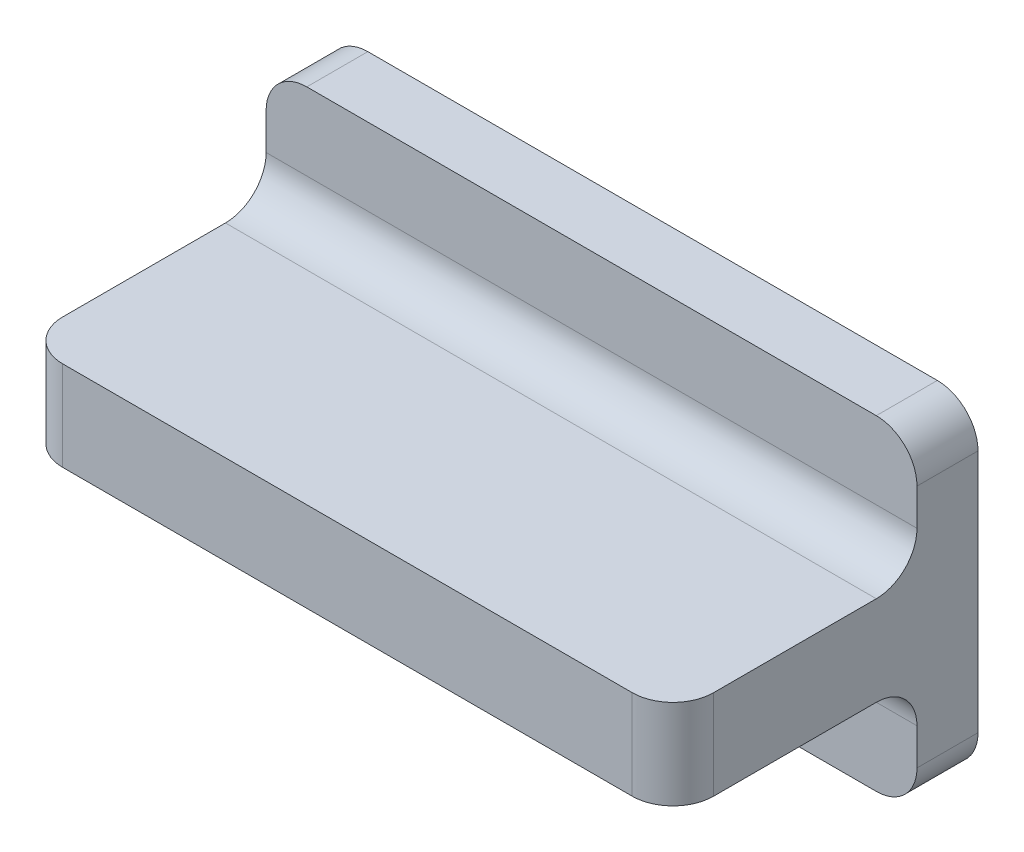
ISO-10303-21;
HEADER;
FILE_DESCRIPTION(('STEP AP214'),'2;1');
FILE_NAME('part.step','',(''),(''),'','','');
FILE_SCHEMA(('AUTOMOTIVE_DESIGN { 1 0 10303 214 1 1 1 1 }'));
ENDSEC;
DATA;
#1=APPLICATION_CONTEXT('core data for automotive mechanical design processes');
#2=APPLICATION_PROTOCOL_DEFINITION('international standard','automotive_design',2000,#1);
#3=PRODUCT_CONTEXT('',#1,'mechanical');
#4=PRODUCT('Part','Part','',(#3));
#5=PRODUCT_RELATED_PRODUCT_CATEGORY('part','',(#4));
#6=PRODUCT_DEFINITION_FORMATION('','',#4);
#7=PRODUCT_DEFINITION_CONTEXT('part definition',#1,'design');
#8=PRODUCT_DEFINITION('design','',#6,#7);
#9=PRODUCT_DEFINITION_SHAPE('','',#8);
#10=(LENGTH_UNIT() NAMED_UNIT(*) SI_UNIT(.MILLI.,.METRE.));
#11=(NAMED_UNIT(*) PLANE_ANGLE_UNIT() SI_UNIT($,.RADIAN.));
#12=(NAMED_UNIT(*) SI_UNIT($,.STERADIAN.) SOLID_ANGLE_UNIT());
#13=UNCERTAINTY_MEASURE_WITH_UNIT(LENGTH_MEASURE(1.E-05),#10,'distance_accuracy_value','');
#14=(GEOMETRIC_REPRESENTATION_CONTEXT(3) GLOBAL_UNCERTAINTY_ASSIGNED_CONTEXT((#13)) GLOBAL_UNIT_ASSIGNED_CONTEXT((#10,
#11,#12)) REPRESENTATION_CONTEXT('',''));
#15=CARTESIAN_POINT('',(0.,0.,0.));
#16=DIRECTION('',(0.,0.,1.));
#17=DIRECTION('',(1.,0.,0.));
#18=AXIS2_PLACEMENT_3D('',#15,#16,#17);
#19=CARTESIAN_POINT('',(0.,0.,4.7625));
#20=DIRECTION('',(0.,0.,1.));
#21=DIRECTION('',(1.,0.,0.));
#22=AXIS2_PLACEMENT_3D('',#19,#20,#21);
#23=PLANE('',#22);
#24=DIRECTION('',(0.,1.,0.));
#25=VECTOR('',#24,1.);
#26=CARTESIAN_POINT('',(25.4,12.7,4.7625));
#27=LINE('',#26,#25);
#28=CARTESIAN_POINT('',(25.4,-9.525,4.7625));
#29=VERTEX_POINT('',#28);
#30=CARTESIAN_POINT('',(25.4,-6.675,4.7625));
#31=VERTEX_POINT('',#30);
#32=EDGE_CURVE('E238',#29,#31,#27,.T.);
#33=ORIENTED_EDGE('',*,*,#32,.T.);
#34=DIRECTION('',(1.,0.,0.));
#35=VECTOR('',#34,1.);
#36=CARTESIAN_POINT('',(0.,-6.675,4.7625));
#37=LINE('',#36,#35);
#38=CARTESIAN_POINT('',(-25.4,-6.675,4.7625));
#39=VERTEX_POINT('',#38);
#40=EDGE_CURVE('E198',#31,#39,#37,.F.);
#41=ORIENTED_EDGE('',*,*,#40,.T.);
#42=DIRECTION('',(0.,-1.,0.));
#43=VECTOR('',#42,1.);
#44=CARTESIAN_POINT('',(-25.4,12.7,4.7625));
#45=LINE('',#44,#43);
#46=CARTESIAN_POINT('',(-25.4,-9.525,4.7625));
#47=VERTEX_POINT('',#46);
#48=EDGE_CURVE('E255',#39,#47,#45,.T.);
#49=ORIENTED_EDGE('',*,*,#48,.T.);
#50=CARTESIAN_POINT('',(-22.225,-9.525,4.7625));
#51=DIRECTION('',(0.,0.,1.));
#52=DIRECTION('',(1.,0.,0.));
#53=AXIS2_PLACEMENT_3D('',#50,#51,#52);
#54=CIRCLE('',#53,3.175);
#55=CARTESIAN_POINT('',(-22.225,-12.7,4.7625));
#56=VERTEX_POINT('',#55);
#57=EDGE_CURVE('E194',#47,#56,#54,.T.);
#58=ORIENTED_EDGE('',*,*,#57,.T.);
#59=DIRECTION('',(1.,0.,0.));
#60=VECTOR('',#59,1.);
#61=CARTESIAN_POINT('',(-25.4,-12.7,4.7625));
#62=LINE('',#61,#60);
#63=CARTESIAN_POINT('',(22.225,-12.7,4.7625));
#64=VERTEX_POINT('',#63);
#65=EDGE_CURVE('E178',#56,#64,#62,.T.);
#66=ORIENTED_EDGE('',*,*,#65,.T.);
#67=CARTESIAN_POINT('',(22.225,-9.525,4.7625));
#68=DIRECTION('',(0.,0.,1.));
#69=DIRECTION('',(1.,0.,0.));
#70=AXIS2_PLACEMENT_3D('',#67,#68,#69);
#71=CIRCLE('',#70,3.175);
#72=EDGE_CURVE('E196',#64,#29,#71,.T.);
#73=ORIENTED_EDGE('',*,*,#72,.T.);
#74=EDGE_LOOP('',(#33,#41,#49,#58,#66,#73));
#75=FACE_BOUND('',#74,.T.);
#76=ADVANCED_FACE('F33',(#75),#23,.T.);
#77=CARTESIAN_POINT('',(25.4,12.7,4.7625));
#78=DIRECTION('',(-1.,0.,0.));
#79=DIRECTION('',(0.,0.,1.));
#80=AXIS2_PLACEMENT_3D('',#77,#78,#79);
#81=PLANE('',#80);
#82=DIRECTION('',(0.,0.,-1.));
#83=VECTOR('',#82,1.);
#84=CARTESIAN_POINT('',(25.4,3.5,23.8125));
#85=LINE('',#84,#83);
#86=CARTESIAN_POINT('',(25.4,3.5,20.6375));
#87=VERTEX_POINT('',#86);
#88=CARTESIAN_POINT('',(25.4,3.5,7.93750000000001));
#89=VERTEX_POINT('',#88);
#90=EDGE_CURVE('E168',#87,#89,#85,.T.);
#91=ORIENTED_EDGE('',*,*,#90,.F.);
#92=DIRECTION('',(0.,1.,0.));
#93=VECTOR('',#92,1.);
#94=CARTESIAN_POINT('',(25.4,-3.5,20.6375));
#95=LINE('',#94,#93);
#96=CARTESIAN_POINT('',(25.4,-3.5,20.6375));
#97=VERTEX_POINT('',#96);
#98=EDGE_CURVE('E212',#87,#97,#95,.F.);
#99=ORIENTED_EDGE('',*,*,#98,.T.);
#100=DIRECTION('',(0.,0.,-1.));
#101=VECTOR('',#100,1.);
#102=CARTESIAN_POINT('',(25.4,-3.5,23.8125));
#103=LINE('',#102,#101);
#104=CARTESIAN_POINT('',(25.4,-3.5,7.93750000000001));
#105=VERTEX_POINT('',#104);
#106=EDGE_CURVE('E241',#97,#105,#103,.T.);
#107=ORIENTED_EDGE('',*,*,#106,.T.);
#108=CARTESIAN_POINT('',(25.4,-6.675,7.9375));
#109=DIRECTION('',(-1.,0.,0.));
#110=DIRECTION('',(0.,0.,1.));
#111=AXIS2_PLACEMENT_3D('',#108,#109,#110);
#112=CIRCLE('',#111,3.175);
#113=EDGE_CURVE('E41',#105,#31,#112,.T.);
#114=ORIENTED_EDGE('',*,*,#113,.T.);
#115=ORIENTED_EDGE('',*,*,#32,.F.);
#116=DIRECTION('',(0.,0.,-1.));
#117=VECTOR('',#116,1.);
#118=CARTESIAN_POINT('',(25.4,-9.525,4.7625));
#119=LINE('',#118,#117);
#120=CARTESIAN_POINT('',(25.4,-9.525,0.));
#121=VERTEX_POINT('',#120);
#122=EDGE_CURVE('E156',#29,#121,#119,.T.);
#123=ORIENTED_EDGE('',*,*,#122,.T.);
#124=DIRECTION('',(0.,1.,0.));
#125=VECTOR('',#124,1.);
#126=CARTESIAN_POINT('',(25.4,12.7,0.));
#127=LINE('',#126,#125);
#128=CARTESIAN_POINT('',(25.4,9.525,0.));
#129=VERTEX_POINT('',#128);
#130=EDGE_CURVE('E264',#121,#129,#127,.T.);
#131=ORIENTED_EDGE('',*,*,#130,.T.);
#132=DIRECTION('',(0.,0.,-1.));
#133=VECTOR('',#132,1.);
#134=CARTESIAN_POINT('',(25.4,9.525,4.7625));
#135=LINE('',#134,#133);
#136=CARTESIAN_POINT('',(25.4,9.525,4.7625));
#137=VERTEX_POINT('',#136);
#138=EDGE_CURVE('E210',#129,#137,#135,.F.);
#139=ORIENTED_EDGE('',*,*,#138,.T.);
#140=CARTESIAN_POINT('',(25.4,6.675,4.7625));
#141=VERTEX_POINT('',#140);
#142=EDGE_CURVE('E251',#141,#137,#27,.T.);
#143=ORIENTED_EDGE('',*,*,#142,.F.);
#144=CARTESIAN_POINT('',(25.4,6.675,7.9375));
#145=DIRECTION('',(-1.,0.,0.));
#146=DIRECTION('',(0.,0.,1.));
#147=AXIS2_PLACEMENT_3D('',#144,#145,#146);
#148=CIRCLE('',#147,3.175);
#149=EDGE_CURVE('E231',#141,#89,#148,.T.);
#150=ORIENTED_EDGE('',*,*,#149,.T.);
#151=EDGE_LOOP('',(#91,#99,#107,#114,#115,#123,#131,#139,#143,#150));
#152=FACE_BOUND('',#151,.T.);
#153=ADVANCED_FACE('F237',(#152),#81,.F.);
#154=CARTESIAN_POINT('',(-25.4,12.7,4.7625));
#155=DIRECTION('',(0.,-1.,0.));
#156=DIRECTION('',(0.,0.,-1.));
#157=AXIS2_PLACEMENT_3D('',#154,#155,#156);
#158=PLANE('',#157);
#159=DIRECTION('',(-1.,0.,0.));
#160=VECTOR('',#159,1.);
#161=CARTESIAN_POINT('',(-25.4,12.7,4.7625));
#162=LINE('',#161,#160);
#163=CARTESIAN_POINT('',(22.225,12.7,4.7625));
#164=VERTEX_POINT('',#163);
#165=CARTESIAN_POINT('',(-22.225,12.7,4.7625));
#166=VERTEX_POINT('',#165);
#167=EDGE_CURVE('E250',#164,#166,#162,.T.);
#168=ORIENTED_EDGE('',*,*,#167,.F.);
#169=DIRECTION('',(0.,0.,-1.));
#170=VECTOR('',#169,1.);
#171=CARTESIAN_POINT('',(22.225,12.7,4.7625));
#172=LINE('',#171,#170);
#173=CARTESIAN_POINT('',(22.225,12.7,0.));
#174=VERTEX_POINT('',#173);
#175=EDGE_CURVE('E216',#164,#174,#172,.T.);
#176=ORIENTED_EDGE('',*,*,#175,.T.);
#177=DIRECTION('',(-1.,0.,0.));
#178=VECTOR('',#177,1.);
#179=CARTESIAN_POINT('',(-25.4,12.7,0.));
#180=LINE('',#179,#178);
#181=CARTESIAN_POINT('',(-22.225,12.7,0.));
#182=VERTEX_POINT('',#181);
#183=EDGE_CURVE('E273',#174,#182,#180,.T.);
#184=ORIENTED_EDGE('',*,*,#183,.T.);
#185=DIRECTION('',(0.,0.,-1.));
#186=VECTOR('',#185,1.);
#187=CARTESIAN_POINT('',(-22.225,12.7,4.7625));
#188=LINE('',#187,#186);
#189=EDGE_CURVE('E214',#182,#166,#188,.F.);
#190=ORIENTED_EDGE('',*,*,#189,.T.);
#191=EDGE_LOOP('',(#168,#176,#184,#190));
#192=FACE_BOUND('',#191,.T.);
#193=ADVANCED_FACE('F296',(#192),#158,.F.);
#194=CARTESIAN_POINT('',(-25.4,12.7,4.7625));
#195=DIRECTION('',(1.,0.,0.));
#196=DIRECTION('',(0.,1.,0.));
#197=AXIS2_PLACEMENT_3D('',#194,#195,#196);
#198=PLANE('',#197);
#199=DIRECTION('',(0.,0.,-1.));
#200=VECTOR('',#199,1.);
#201=CARTESIAN_POINT('',(-25.4,-3.5,23.8125));
#202=LINE('',#201,#200);
#203=CARTESIAN_POINT('',(-25.4,-3.5,20.6375));
#204=VERTEX_POINT('',#203);
#205=CARTESIAN_POINT('',(-25.4,-3.5,7.93750000000001));
#206=VERTEX_POINT('',#205);
#207=EDGE_CURVE('E153',#204,#206,#202,.T.);
#208=ORIENTED_EDGE('',*,*,#207,.F.);
#209=DIRECTION('',(0.,-1.,0.));
#210=VECTOR('',#209,1.);
#211=CARTESIAN_POINT('',(-25.4,3.5,20.6375));
#212=LINE('',#211,#210);
#213=CARTESIAN_POINT('',(-25.4,3.5,20.6375));
#214=VERTEX_POINT('',#213);
#215=EDGE_CURVE('E148',#204,#214,#212,.F.);
#216=ORIENTED_EDGE('',*,*,#215,.T.);
#217=DIRECTION('',(0.,0.,-1.));
#218=VECTOR('',#217,1.);
#219=CARTESIAN_POINT('',(-25.4,3.5,23.8125));
#220=LINE('',#219,#218);
#221=CARTESIAN_POINT('',(-25.4,3.5,7.93750000000001));
#222=VERTEX_POINT('',#221);
#223=EDGE_CURVE('E151',#214,#222,#220,.T.);
#224=ORIENTED_EDGE('',*,*,#223,.T.);
#225=CARTESIAN_POINT('',(-25.4,6.675,7.9375));
#226=DIRECTION('',(1.,0.,0.));
#227=DIRECTION('',(0.,1.,0.));
#228=AXIS2_PLACEMENT_3D('',#225,#226,#227);
#229=CIRCLE('',#228,3.175);
#230=CARTESIAN_POINT('',(-25.4,6.675,4.7625));
#231=VERTEX_POINT('',#230);
#232=EDGE_CURVE('E229',#222,#231,#229,.T.);
#233=ORIENTED_EDGE('',*,*,#232,.T.);
#234=CARTESIAN_POINT('',(-25.4,9.525,4.7625));
#235=VERTEX_POINT('',#234);
#236=EDGE_CURVE('E269',#235,#231,#45,.T.);
#237=ORIENTED_EDGE('',*,*,#236,.F.);
#238=DIRECTION('',(0.,0.,-1.));
#239=VECTOR('',#238,1.);
#240=CARTESIAN_POINT('',(-25.4,9.525,4.7625));
#241=LINE('',#240,#239);
#242=CARTESIAN_POINT('',(-25.4,9.525,0.));
#243=VERTEX_POINT('',#242);
#244=EDGE_CURVE('E157',#235,#243,#241,.T.);
#245=ORIENTED_EDGE('',*,*,#244,.T.);
#246=DIRECTION('',(0.,-1.,0.));
#247=VECTOR('',#246,1.);
#248=CARTESIAN_POINT('',(-25.4,12.7,0.));
#249=LINE('',#248,#247);
#250=CARTESIAN_POINT('',(-25.4,-9.525,0.));
#251=VERTEX_POINT('',#250);
#252=EDGE_CURVE('E276',#243,#251,#249,.T.);
#253=ORIENTED_EDGE('',*,*,#252,.T.);
#254=DIRECTION('',(0.,0.,-1.));
#255=VECTOR('',#254,1.);
#256=CARTESIAN_POINT('',(-25.4,-9.525,4.7625));
#257=LINE('',#256,#255);
#258=EDGE_CURVE('E204',#251,#47,#257,.F.);
#259=ORIENTED_EDGE('',*,*,#258,.T.);
#260=ORIENTED_EDGE('',*,*,#48,.F.);
#261=CARTESIAN_POINT('',(-25.4,-6.675,7.9375));
#262=DIRECTION('',(1.,0.,0.));
#263=DIRECTION('',(0.,1.,0.));
#264=AXIS2_PLACEMENT_3D('',#261,#262,#263);
#265=CIRCLE('',#264,3.175);
#266=EDGE_CURVE('E11',#39,#206,#265,.T.);
#267=ORIENTED_EDGE('',*,*,#266,.T.);
#268=EDGE_LOOP('',(#208,#216,#224,#233,#237,#245,#253,#259,#260,#267));
#269=FACE_BOUND('',#268,.T.);
#270=ADVANCED_FACE('F150',(#269),#198,.F.);
#271=CARTESIAN_POINT('',(-25.4,-12.7,4.7625));
#272=DIRECTION('',(0.,1.,0.));
#273=DIRECTION('',(0.,0.,1.));
#274=AXIS2_PLACEMENT_3D('',#271,#272,#273);
#275=PLANE('',#274);
#276=DIRECTION('',(1.,0.,0.));
#277=VECTOR('',#276,1.);
#278=CARTESIAN_POINT('',(-25.4,-12.7,0.));
#279=LINE('',#278,#277);
#280=CARTESIAN_POINT('',(-22.225,-12.7,0.));
#281=VERTEX_POINT('',#280);
#282=CARTESIAN_POINT('',(22.225,-12.7,0.));
#283=VERTEX_POINT('',#282);
#284=EDGE_CURVE('E278',#281,#283,#279,.T.);
#285=ORIENTED_EDGE('',*,*,#284,.T.);
#286=DIRECTION('',(0.,0.,-1.));
#287=VECTOR('',#286,1.);
#288=CARTESIAN_POINT('',(22.225,-12.7,4.7625));
#289=LINE('',#288,#287);
#290=EDGE_CURVE('E227',#283,#64,#289,.F.);
#291=ORIENTED_EDGE('',*,*,#290,.T.);
#292=ORIENTED_EDGE('',*,*,#65,.F.);
#293=DIRECTION('',(0.,0.,-1.));
#294=VECTOR('',#293,1.);
#295=CARTESIAN_POINT('',(-22.225,-12.7,4.7625));
#296=LINE('',#295,#294);
#297=EDGE_CURVE('E225',#56,#281,#296,.T.);
#298=ORIENTED_EDGE('',*,*,#297,.T.);
#299=EDGE_LOOP('',(#285,#291,#292,#298));
#300=FACE_BOUND('',#299,.T.);
#301=ADVANCED_FACE('F334',(#300),#275,.F.);
#302=ORIENTED_EDGE('',*,*,#236,.T.);
#303=DIRECTION('',(-1.,0.,0.));
#304=VECTOR('',#303,1.);
#305=CARTESIAN_POINT('',(0.,6.675,4.7625));
#306=LINE('',#305,#304);
#307=EDGE_CURVE('E185',#231,#141,#306,.F.);
#308=ORIENTED_EDGE('',*,*,#307,.T.);
#309=ORIENTED_EDGE('',*,*,#142,.T.);
#310=CARTESIAN_POINT('',(22.225,9.525,4.7625));
#311=DIRECTION('',(0.,0.,1.));
#312=DIRECTION('',(1.,0.,0.));
#313=AXIS2_PLACEMENT_3D('',#310,#311,#312);
#314=CIRCLE('',#313,3.175);
#315=EDGE_CURVE('E183',#137,#164,#314,.T.);
#316=ORIENTED_EDGE('',*,*,#315,.T.);
#317=ORIENTED_EDGE('',*,*,#167,.T.);
#318=CARTESIAN_POINT('',(-22.225,9.525,4.7625));
#319=DIRECTION('',(0.,0.,1.));
#320=DIRECTION('',(1.,0.,0.));
#321=AXIS2_PLACEMENT_3D('',#318,#319,#320);
#322=CIRCLE('',#321,3.175);
#323=EDGE_CURVE('E176',#166,#235,#322,.T.);
#324=ORIENTED_EDGE('',*,*,#323,.T.);
#325=EDGE_LOOP('',(#302,#308,#309,#316,#317,#324));
#326=FACE_BOUND('',#325,.T.);
#327=ADVANCED_FACE('F286',(#326),#23,.T.);
#328=CARTESIAN_POINT('',(0.,0.,0.));
#329=DIRECTION('',(0.,0.,1.));
#330=DIRECTION('',(1.,0.,0.));
#331=AXIS2_PLACEMENT_3D('',#328,#329,#330);
#332=PLANE('',#331);
#333=ORIENTED_EDGE('',*,*,#183,.F.);
#334=CARTESIAN_POINT('',(22.225,9.525,0.));
#335=DIRECTION('',(0.,0.,1.));
#336=DIRECTION('',(1.,0.,0.));
#337=AXIS2_PLACEMENT_3D('',#334,#335,#336);
#338=CIRCLE('',#337,3.175);
#339=EDGE_CURVE('E223',#174,#129,#338,.F.);
#340=ORIENTED_EDGE('',*,*,#339,.T.);
#341=ORIENTED_EDGE('',*,*,#130,.F.);
#342=CARTESIAN_POINT('',(22.225,-9.525,0.));
#343=DIRECTION('',(0.,0.,1.));
#344=DIRECTION('',(1.,0.,0.));
#345=AXIS2_PLACEMENT_3D('',#342,#343,#344);
#346=CIRCLE('',#345,3.175);
#347=EDGE_CURVE('E48',#121,#283,#346,.F.);
#348=ORIENTED_EDGE('',*,*,#347,.T.);
#349=ORIENTED_EDGE('',*,*,#284,.F.);
#350=CARTESIAN_POINT('',(-22.225,-9.525,0.));
#351=DIRECTION('',(0.,0.,1.));
#352=DIRECTION('',(1.,0.,0.));
#353=AXIS2_PLACEMENT_3D('',#350,#351,#352);
#354=CIRCLE('',#353,3.175);
#355=EDGE_CURVE('E56',#281,#251,#354,.F.);
#356=ORIENTED_EDGE('',*,*,#355,.T.);
#357=ORIENTED_EDGE('',*,*,#252,.F.);
#358=CARTESIAN_POINT('',(-22.225,9.525,0.));
#359=DIRECTION('',(0.,0.,1.));
#360=DIRECTION('',(1.,0.,0.));
#361=AXIS2_PLACEMENT_3D('',#358,#359,#360);
#362=CIRCLE('',#361,3.175);
#363=EDGE_CURVE('E220',#243,#182,#362,.F.);
#364=ORIENTED_EDGE('',*,*,#363,.T.);
#365=EDGE_LOOP('',(#333,#340,#341,#348,#349,#356,#357,#364));
#366=FACE_BOUND('',#365,.T.);
#367=ADVANCED_FACE('F298',(#366),#332,.F.);
#368=CARTESIAN_POINT('',(-25.4,3.5,23.8125));
#369=DIRECTION('',(0.,-1.,0.));
#370=DIRECTION('',(0.,0.,-1.));
#371=AXIS2_PLACEMENT_3D('',#368,#369,#370);
#372=PLANE('',#371);
#373=ORIENTED_EDGE('',*,*,#90,.T.);
#374=DIRECTION('',(-1.,0.,0.));
#375=VECTOR('',#374,1.);
#376=CARTESIAN_POINT('',(-25.4,3.5,7.9375));
#377=LINE('',#376,#375);
#378=EDGE_CURVE('E167',#89,#222,#377,.T.);
#379=ORIENTED_EDGE('',*,*,#378,.T.);
#380=ORIENTED_EDGE('',*,*,#223,.F.);
#381=CARTESIAN_POINT('',(-22.225,3.5,20.6375));
#382=DIRECTION('',(0.,-1.,0.));
#383=DIRECTION('',(0.,0.,-1.));
#384=AXIS2_PLACEMENT_3D('',#381,#382,#383);
#385=CIRCLE('',#384,3.175);
#386=CARTESIAN_POINT('',(-22.225,3.5,23.8125));
#387=VERTEX_POINT('',#386);
#388=EDGE_CURVE('E164',#214,#387,#385,.F.);
#389=ORIENTED_EDGE('',*,*,#388,.T.);
#390=DIRECTION('',(-1.,0.,0.));
#391=VECTOR('',#390,1.);
#392=CARTESIAN_POINT('',(-25.4,3.5,23.8125));
#393=LINE('',#392,#391);
#394=CARTESIAN_POINT('',(22.225,3.5,23.8125));
#395=VERTEX_POINT('',#394);
#396=EDGE_CURVE('E308',#395,#387,#393,.T.);
#397=ORIENTED_EDGE('',*,*,#396,.F.);
#398=CARTESIAN_POINT('',(22.225,3.5,20.6375));
#399=DIRECTION('',(0.,-1.,0.));
#400=DIRECTION('',(0.,0.,-1.));
#401=AXIS2_PLACEMENT_3D('',#398,#399,#400);
#402=CIRCLE('',#401,3.175);
#403=EDGE_CURVE('E174',#395,#87,#402,.F.);
#404=ORIENTED_EDGE('',*,*,#403,.T.);
#405=EDGE_LOOP('',(#373,#379,#380,#389,#397,#404));
#406=FACE_BOUND('',#405,.T.);
#407=ADVANCED_FACE('F162',(#406),#372,.F.);
#408=CARTESIAN_POINT('',(-25.4,-3.5,23.8125));
#409=DIRECTION('',(0.,1.,0.));
#410=DIRECTION('',(0.,0.,1.));
#411=AXIS2_PLACEMENT_3D('',#408,#409,#410);
#412=PLANE('',#411);
#413=ORIENTED_EDGE('',*,*,#207,.T.);
#414=DIRECTION('',(1.,0.,0.));
#415=VECTOR('',#414,1.);
#416=CARTESIAN_POINT('',(-25.4,-3.5,7.9375));
#417=LINE('',#416,#415);
#418=EDGE_CURVE('E191',#206,#105,#417,.T.);
#419=ORIENTED_EDGE('',*,*,#418,.T.);
#420=ORIENTED_EDGE('',*,*,#106,.F.);
#421=CARTESIAN_POINT('',(22.225,-3.5,20.6375));
#422=DIRECTION('',(0.,1.,0.));
#423=DIRECTION('',(0.,0.,1.));
#424=AXIS2_PLACEMENT_3D('',#421,#422,#423);
#425=CIRCLE('',#424,3.175);
#426=CARTESIAN_POINT('',(22.225,-3.5,23.8125));
#427=VERTEX_POINT('',#426);
#428=EDGE_CURVE('E187',#97,#427,#425,.F.);
#429=ORIENTED_EDGE('',*,*,#428,.T.);
#430=DIRECTION('',(1.,0.,0.));
#431=VECTOR('',#430,1.);
#432=CARTESIAN_POINT('',(-25.4,-3.5,23.8125));
#433=LINE('',#432,#431);
#434=CARTESIAN_POINT('',(-22.225,-3.5,23.8125));
#435=VERTEX_POINT('',#434);
#436=EDGE_CURVE('E260',#435,#427,#433,.T.);
#437=ORIENTED_EDGE('',*,*,#436,.F.);
#438=CARTESIAN_POINT('',(-22.225,-3.5,20.6375));
#439=DIRECTION('',(0.,1.,0.));
#440=DIRECTION('',(0.,0.,1.));
#441=AXIS2_PLACEMENT_3D('',#438,#439,#440);
#442=CIRCLE('',#441,3.175);
#443=EDGE_CURVE('E189',#435,#204,#442,.F.);
#444=ORIENTED_EDGE('',*,*,#443,.T.);
#445=EDGE_LOOP('',(#413,#419,#420,#429,#437,#444));
#446=FACE_BOUND('',#445,.T.);
#447=ADVANCED_FACE('F257',(#446),#412,.F.);
#448=CARTESIAN_POINT('',(0.,0.,23.8125));
#449=DIRECTION('',(0.,0.,1.));
#450=DIRECTION('',(1.,0.,0.));
#451=AXIS2_PLACEMENT_3D('',#448,#449,#450);
#452=PLANE('',#451);
#453=ORIENTED_EDGE('',*,*,#396,.T.);
#454=DIRECTION('',(0.,-1.,0.));
#455=VECTOR('',#454,1.);
#456=CARTESIAN_POINT('',(-22.225,-3.5,23.8125));
#457=LINE('',#456,#455);
#458=EDGE_CURVE('E173',#387,#435,#457,.T.);
#459=ORIENTED_EDGE('',*,*,#458,.T.);
#460=ORIENTED_EDGE('',*,*,#436,.T.);
#461=DIRECTION('',(0.,1.,0.));
#462=VECTOR('',#461,1.);
#463=CARTESIAN_POINT('',(22.225,3.5,23.8125));
#464=LINE('',#463,#462);
#465=EDGE_CURVE('E200',#427,#395,#464,.T.);
#466=ORIENTED_EDGE('',*,*,#465,.T.);
#467=EDGE_LOOP('',(#453,#459,#460,#466));
#468=FACE_BOUND('',#467,.T.);
#469=ADVANCED_FACE('F315',(#468),#452,.T.);
#470=CARTESIAN_POINT('',(-25.4,6.675,7.9375));
#471=DIRECTION('',(-1.,0.,0.));
#472=DIRECTION('',(0.,0.,1.));
#473=AXIS2_PLACEMENT_3D('',#470,#471,#472);
#474=CYLINDRICAL_SURFACE('',#473,3.175);
#475=ORIENTED_EDGE('',*,*,#149,.F.);
#476=ORIENTED_EDGE('',*,*,#307,.F.);
#477=ORIENTED_EDGE('',*,*,#232,.F.);
#478=ORIENTED_EDGE('',*,*,#378,.F.);
#479=EDGE_LOOP('',(#475,#476,#477,#478));
#480=FACE_BOUND('',#479,.T.);
#481=ADVANCED_FACE('F306',(#480),#474,.F.);
#482=CARTESIAN_POINT('',(-25.4,-6.675,7.9375));
#483=DIRECTION('',(1.,0.,0.));
#484=DIRECTION('',(0.,0.,-1.));
#485=AXIS2_PLACEMENT_3D('',#482,#483,#484);
#486=CYLINDRICAL_SURFACE('',#485,3.175);
#487=ORIENTED_EDGE('',*,*,#266,.F.);
#488=ORIENTED_EDGE('',*,*,#40,.F.);
#489=ORIENTED_EDGE('',*,*,#113,.F.);
#490=ORIENTED_EDGE('',*,*,#418,.F.);
#491=EDGE_LOOP('',(#487,#488,#489,#490));
#492=FACE_BOUND('',#491,.T.);
#493=ADVANCED_FACE('F254',(#492),#486,.F.);
#494=CARTESIAN_POINT('',(-22.225,0.,20.6375));
#495=DIRECTION('',(0.,1.,0.));
#496=DIRECTION('',(-1.,0.,0.));
#497=AXIS2_PLACEMENT_3D('',#494,#495,#496);
#498=CYLINDRICAL_SURFACE('',#497,3.175);
#499=ORIENTED_EDGE('',*,*,#388,.F.);
#500=ORIENTED_EDGE('',*,*,#215,.F.);
#501=ORIENTED_EDGE('',*,*,#443,.F.);
#502=ORIENTED_EDGE('',*,*,#458,.F.);
#503=EDGE_LOOP('',(#499,#500,#501,#502));
#504=FACE_BOUND('',#503,.T.);
#505=ADVANCED_FACE('F171',(#504),#498,.T.);
#506=CARTESIAN_POINT('',(22.225,0.,20.6375));
#507=DIRECTION('',(0.,-1.,0.));
#508=DIRECTION('',(0.,0.,-1.));
#509=AXIS2_PLACEMENT_3D('',#506,#507,#508);
#510=CYLINDRICAL_SURFACE('',#509,3.175);
#511=ORIENTED_EDGE('',*,*,#428,.F.);
#512=ORIENTED_EDGE('',*,*,#98,.F.);
#513=ORIENTED_EDGE('',*,*,#403,.F.);
#514=ORIENTED_EDGE('',*,*,#465,.F.);
#515=EDGE_LOOP('',(#511,#512,#513,#514));
#516=FACE_BOUND('',#515,.T.);
#517=ADVANCED_FACE('F312',(#516),#510,.T.);
#518=CARTESIAN_POINT('',(22.225,9.525,4.7625));
#519=DIRECTION('',(0.,0.,-1.));
#520=DIRECTION('',(-1.,0.,0.));
#521=AXIS2_PLACEMENT_3D('',#518,#519,#520);
#522=CYLINDRICAL_SURFACE('',#521,3.175);
#523=ORIENTED_EDGE('',*,*,#315,.F.);
#524=ORIENTED_EDGE('',*,*,#138,.F.);
#525=ORIENTED_EDGE('',*,*,#339,.F.);
#526=ORIENTED_EDGE('',*,*,#175,.F.);
#527=EDGE_LOOP('',(#523,#524,#525,#526));
#528=FACE_BOUND('',#527,.T.);
#529=ADVANCED_FACE('F293',(#528),#522,.T.);
#530=CARTESIAN_POINT('',(22.225,-9.525,4.7625));
#531=DIRECTION('',(0.,0.,-1.));
#532=DIRECTION('',(-1.,0.,0.));
#533=AXIS2_PLACEMENT_3D('',#530,#531,#532);
#534=CYLINDRICAL_SURFACE('',#533,3.175);
#535=ORIENTED_EDGE('',*,*,#72,.F.);
#536=ORIENTED_EDGE('',*,*,#290,.F.);
#537=ORIENTED_EDGE('',*,*,#347,.F.);
#538=ORIENTED_EDGE('',*,*,#122,.F.);
#539=EDGE_LOOP('',(#535,#536,#537,#538));
#540=FACE_BOUND('',#539,.T.);
#541=ADVANCED_FACE('F355',(#540),#534,.T.);
#542=CARTESIAN_POINT('',(-22.225,9.525,4.7625));
#543=DIRECTION('',(0.,0.,-1.));
#544=DIRECTION('',(-1.,0.,0.));
#545=AXIS2_PLACEMENT_3D('',#542,#543,#544);
#546=CYLINDRICAL_SURFACE('',#545,3.175);
#547=ORIENTED_EDGE('',*,*,#323,.F.);
#548=ORIENTED_EDGE('',*,*,#189,.F.);
#549=ORIENTED_EDGE('',*,*,#363,.F.);
#550=ORIENTED_EDGE('',*,*,#244,.F.);
#551=EDGE_LOOP('',(#547,#548,#549,#550));
#552=FACE_BOUND('',#551,.T.);
#553=ADVANCED_FACE('F303',(#552),#546,.T.);
#554=CARTESIAN_POINT('',(-22.225,-9.525,4.7625));
#555=DIRECTION('',(0.,0.,-1.));
#556=DIRECTION('',(-1.,0.,0.));
#557=AXIS2_PLACEMENT_3D('',#554,#555,#556);
#558=CYLINDRICAL_SURFACE('',#557,3.175);
#559=ORIENTED_EDGE('',*,*,#57,.F.);
#560=ORIENTED_EDGE('',*,*,#258,.F.);
#561=ORIENTED_EDGE('',*,*,#355,.F.);
#562=ORIENTED_EDGE('',*,*,#297,.F.);
#563=EDGE_LOOP('',(#559,#560,#561,#562));
#564=FACE_BOUND('',#563,.T.);
#565=ADVANCED_FACE('F35',(#564),#558,.T.);
#566=CLOSED_SHELL('',(#76,#153,#193,#270,#301,#327,#367,#407,#447,#469,#481,#493,#505,#517,#529,
#541,#553,#565));
#567=MANIFOLD_SOLID_BREP('B2',#566);
#568=ADVANCED_BREP_SHAPE_REPRESENTATION('',(#18,#567),#14);
#569=SHAPE_DEFINITION_REPRESENTATION(#9,#568);
ENDSEC;
END-ISO-10303-21;
